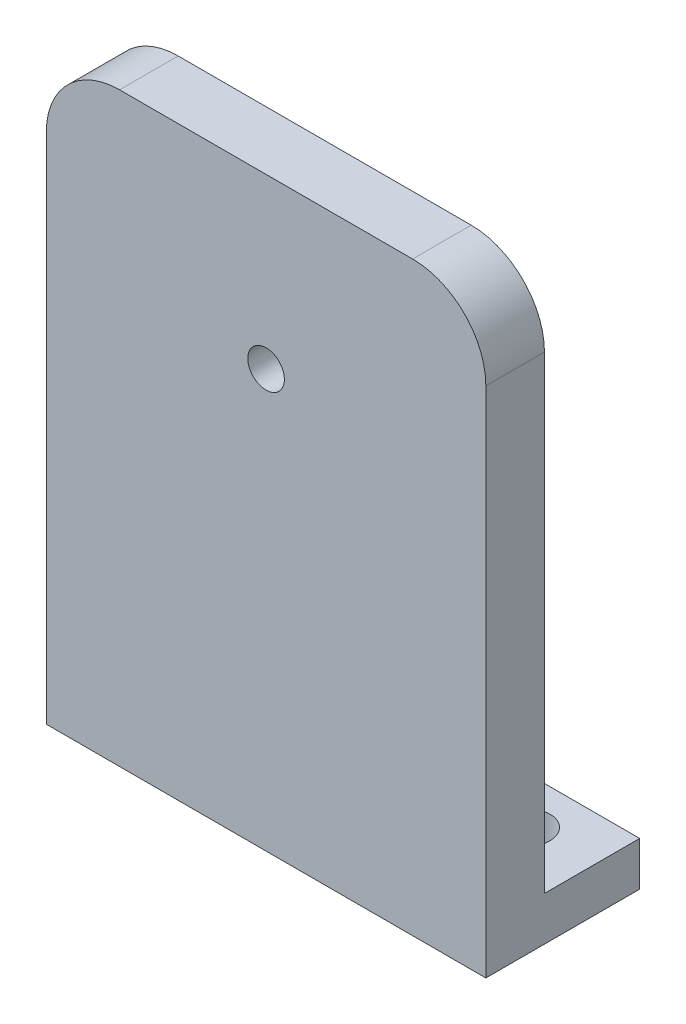
ISO-10303-21;
HEADER;
FILE_DESCRIPTION(('STEP AP214'),'2;1');
FILE_NAME('part.step','',(''),(''),'','','');
FILE_SCHEMA(('AUTOMOTIVE_DESIGN { 1 0 10303 214 1 1 1 1 }'));
ENDSEC;
DATA;
#1=APPLICATION_CONTEXT('core data for automotive mechanical design processes');
#2=APPLICATION_PROTOCOL_DEFINITION('international standard','automotive_design',2000,#1);
#3=PRODUCT_CONTEXT('',#1,'mechanical');
#4=PRODUCT('Part','Part','',(#3));
#5=PRODUCT_RELATED_PRODUCT_CATEGORY('part','',(#4));
#6=PRODUCT_DEFINITION_FORMATION('','',#4);
#7=PRODUCT_DEFINITION_CONTEXT('part definition',#1,'design');
#8=PRODUCT_DEFINITION('design','',#6,#7);
#9=PRODUCT_DEFINITION_SHAPE('','',#8);
#10=(LENGTH_UNIT() NAMED_UNIT(*) SI_UNIT(.MILLI.,.METRE.));
#11=(NAMED_UNIT(*) PLANE_ANGLE_UNIT() SI_UNIT($,.RADIAN.));
#12=(NAMED_UNIT(*) SI_UNIT($,.STERADIAN.) SOLID_ANGLE_UNIT());
#13=UNCERTAINTY_MEASURE_WITH_UNIT(LENGTH_MEASURE(1.E-05),#10,'distance_accuracy_value','');
#14=(GEOMETRIC_REPRESENTATION_CONTEXT(3) GLOBAL_UNCERTAINTY_ASSIGNED_CONTEXT((#13)) GLOBAL_UNIT_ASSIGNED_CONTEXT((#10,
#11,#12)) REPRESENTATION_CONTEXT('',''));
#15=CARTESIAN_POINT('',(0.,0.,0.));
#16=DIRECTION('',(0.,0.,1.));
#17=DIRECTION('',(1.,0.,0.));
#18=AXIS2_PLACEMENT_3D('',#15,#16,#17);
#19=CARTESIAN_POINT('',(0.,3.,0.));
#20=DIRECTION('',(0.,-1.,0.));
#21=DIRECTION('',(0.,0.,-1.));
#22=AXIS2_PLACEMENT_3D('',#19,#20,#21);
#23=PLANE('',#22);
#24=CARTESIAN_POINT('',(10.5,3.,-2.05));
#25=DIRECTION('',(0.,1.,0.));
#26=DIRECTION('',(0.,0.,1.));
#27=AXIS2_PLACEMENT_3D('',#24,#25,#26);
#28=CIRCLE('',#27,1.575);
#29=CARTESIAN_POINT('',(10.5,3.,-0.475));
#30=VERTEX_POINT('',#29);
#31=EDGE_CURVE('E313',#30,#30,#28,.T.);
#32=ORIENTED_EDGE('',*,*,#31,.F.);
#33=EDGE_LOOP('',(#32));
#34=FACE_BOUND('',#33,.T.);
#35=CARTESIAN_POINT('',(-10.5,3.,-2.05));
#36=DIRECTION('',(0.,1.,0.));
#37=DIRECTION('',(0.,0.,1.));
#38=AXIS2_PLACEMENT_3D('',#35,#36,#37);
#39=CIRCLE('',#38,1.575);
#40=CARTESIAN_POINT('',(-10.5,3.,-0.475));
#41=VERTEX_POINT('',#40);
#42=EDGE_CURVE('E127',#41,#41,#39,.T.);
#43=ORIENTED_EDGE('',*,*,#42,.F.);
#44=EDGE_LOOP('',(#43));
#45=FACE_BOUND('',#44,.T.);
#46=DIRECTION('',(-1.,0.,0.));
#47=VECTOR('',#46,1.);
#48=CARTESIAN_POINT('',(-15.,3.,1.25));
#49=LINE('',#48,#47);
#50=CARTESIAN_POINT('',(15.,3.,1.25));
#51=VERTEX_POINT('',#50);
#52=CARTESIAN_POINT('',(-15.,3.,1.25));
#53=VERTEX_POINT('',#52);
#54=EDGE_CURVE('E112',#51,#53,#49,.T.);
#55=ORIENTED_EDGE('',*,*,#54,.F.);
#56=DIRECTION('',(0.,0.,-1.));
#57=VECTOR('',#56,1.);
#58=CARTESIAN_POINT('',(15.,3.,5.25));
#59=LINE('',#58,#57);
#60=CARTESIAN_POINT('',(15.,3.,-5.25));
#61=VERTEX_POINT('',#60);
#62=EDGE_CURVE('E133',#51,#61,#59,.T.);
#63=ORIENTED_EDGE('',*,*,#62,.T.);
#64=DIRECTION('',(-1.,0.,0.));
#65=VECTOR('',#64,1.);
#66=CARTESIAN_POINT('',(-15.,3.,-5.25));
#67=LINE('',#66,#65);
#68=CARTESIAN_POINT('',(-15.,3.,-5.25));
#69=VERTEX_POINT('',#68);
#70=EDGE_CURVE('E115',#61,#69,#67,.T.);
#71=ORIENTED_EDGE('',*,*,#70,.T.);
#72=DIRECTION('',(0.,0.,1.));
#73=VECTOR('',#72,1.);
#74=CARTESIAN_POINT('',(-15.,3.,5.25));
#75=LINE('',#74,#73);
#76=EDGE_CURVE('E102',#69,#53,#75,.T.);
#77=ORIENTED_EDGE('',*,*,#76,.T.);
#78=EDGE_LOOP('',(#55,#63,#71,#77));
#79=FACE_BOUND('',#78,.T.);
#80=ADVANCED_FACE('F32',(#34,#45,#79),#23,.F.);
#81=CARTESIAN_POINT('',(15.,3.,5.25));
#82=DIRECTION('',(-1.,0.,0.));
#83=DIRECTION('',(0.,0.,1.));
#84=AXIS2_PLACEMENT_3D('',#81,#82,#83);
#85=PLANE('',#84);
#86=DIRECTION('',(0.,-1.,0.));
#87=VECTOR('',#86,1.);
#88=CARTESIAN_POINT('',(15.,40.,1.25));
#89=LINE('',#88,#87);
#90=CARTESIAN_POINT('',(15.,35.,1.25));
#91=VERTEX_POINT('',#90);
#92=EDGE_CURVE('E107',#91,#51,#89,.T.);
#93=ORIENTED_EDGE('',*,*,#92,.F.);
#94=DIRECTION('',(0.,0.,-1.));
#95=VECTOR('',#94,1.);
#96=CARTESIAN_POINT('',(15.,35.,5.25));
#97=LINE('',#96,#95);
#98=CARTESIAN_POINT('',(15.,35.,5.25));
#99=VERTEX_POINT('',#98);
#100=EDGE_CURVE('E56',#91,#99,#97,.F.);
#101=ORIENTED_EDGE('',*,*,#100,.T.);
#102=DIRECTION('',(0.,-1.,0.));
#103=VECTOR('',#102,1.);
#104=CARTESIAN_POINT('',(15.,3.,5.25));
#105=LINE('',#104,#103);
#106=CARTESIAN_POINT('',(15.,0.,5.25));
#107=VERTEX_POINT('',#106);
#108=EDGE_CURVE('E117',#99,#107,#105,.T.);
#109=ORIENTED_EDGE('',*,*,#108,.T.);
#110=DIRECTION('',(0.,0.,-1.));
#111=VECTOR('',#110,1.);
#112=CARTESIAN_POINT('',(15.,0.,5.25));
#113=LINE('',#112,#111);
#114=CARTESIAN_POINT('',(15.,0.,-5.25));
#115=VERTEX_POINT('',#114);
#116=EDGE_CURVE('E132',#107,#115,#113,.T.);
#117=ORIENTED_EDGE('',*,*,#116,.T.);
#118=DIRECTION('',(0.,-1.,0.));
#119=VECTOR('',#118,1.);
#120=CARTESIAN_POINT('',(15.,3.,-5.25));
#121=LINE('',#120,#119);
#122=EDGE_CURVE('E151',#61,#115,#121,.T.);
#123=ORIENTED_EDGE('',*,*,#122,.F.);
#124=ORIENTED_EDGE('',*,*,#62,.F.);
#125=EDGE_LOOP('',(#93,#101,#109,#117,#123,#124));
#126=FACE_BOUND('',#125,.T.);
#127=ADVANCED_FACE('F175',(#126),#85,.F.);
#128=CARTESIAN_POINT('',(-15.,3.,-5.25));
#129=DIRECTION('',(0.,0.,1.));
#130=DIRECTION('',(1.,0.,0.));
#131=AXIS2_PLACEMENT_3D('',#128,#129,#130);
#132=PLANE('',#131);
#133=DIRECTION('',(-1.,0.,0.));
#134=VECTOR('',#133,1.);
#135=CARTESIAN_POINT('',(-15.,0.,-5.25));
#136=LINE('',#135,#134);
#137=CARTESIAN_POINT('',(-15.,0.,-5.25));
#138=VERTEX_POINT('',#137);
#139=EDGE_CURVE('E139',#115,#138,#136,.T.);
#140=ORIENTED_EDGE('',*,*,#139,.T.);
#141=DIRECTION('',(0.,-1.,0.));
#142=VECTOR('',#141,1.);
#143=CARTESIAN_POINT('',(-15.,3.,-5.25));
#144=LINE('',#143,#142);
#145=EDGE_CURVE('E149',#69,#138,#144,.T.);
#146=ORIENTED_EDGE('',*,*,#145,.F.);
#147=ORIENTED_EDGE('',*,*,#70,.F.);
#148=ORIENTED_EDGE('',*,*,#122,.T.);
#149=EDGE_LOOP('',(#140,#146,#147,#148));
#150=FACE_BOUND('',#149,.T.);
#151=ADVANCED_FACE('F178',(#150),#132,.F.);
#152=CARTESIAN_POINT('',(-15.,3.,5.25));
#153=DIRECTION('',(1.,0.,0.));
#154=DIRECTION('',(0.,0.,-1.));
#155=AXIS2_PLACEMENT_3D('',#152,#153,#154);
#156=PLANE('',#155);
#157=DIRECTION('',(0.,-1.,0.));
#158=VECTOR('',#157,1.);
#159=CARTESIAN_POINT('',(-15.,3.,5.25));
#160=LINE('',#159,#158);
#161=CARTESIAN_POINT('',(-15.,35.,5.25));
#162=VERTEX_POINT('',#161);
#163=CARTESIAN_POINT('',(-15.,0.,5.25));
#164=VERTEX_POINT('',#163);
#165=EDGE_CURVE('E147',#162,#164,#160,.T.);
#166=ORIENTED_EDGE('',*,*,#165,.F.);
#167=DIRECTION('',(0.,0.,1.));
#168=VECTOR('',#167,1.);
#169=CARTESIAN_POINT('',(-15.,35.,5.25));
#170=LINE('',#169,#168);
#171=CARTESIAN_POINT('',(-15.,35.,1.25));
#172=VERTEX_POINT('',#171);
#173=EDGE_CURVE('E11',#162,#172,#170,.F.);
#174=ORIENTED_EDGE('',*,*,#173,.T.);
#175=DIRECTION('',(0.,-1.,0.));
#176=VECTOR('',#175,1.);
#177=CARTESIAN_POINT('',(-15.,40.,1.25));
#178=LINE('',#177,#176);
#179=EDGE_CURVE('E98',#172,#53,#178,.T.);
#180=ORIENTED_EDGE('',*,*,#179,.T.);
#181=ORIENTED_EDGE('',*,*,#76,.F.);
#182=ORIENTED_EDGE('',*,*,#145,.T.);
#183=DIRECTION('',(0.,0.,1.));
#184=VECTOR('',#183,1.);
#185=CARTESIAN_POINT('',(-15.,0.,5.25));
#186=LINE('',#185,#184);
#187=EDGE_CURVE('E141',#138,#164,#186,.T.);
#188=ORIENTED_EDGE('',*,*,#187,.T.);
#189=EDGE_LOOP('',(#166,#174,#180,#181,#182,#188));
#190=FACE_BOUND('',#189,.T.);
#191=ADVANCED_FACE('F100',(#190),#156,.F.);
#192=CARTESIAN_POINT('',(-15.,3.,5.25));
#193=DIRECTION('',(0.,0.,-1.));
#194=DIRECTION('',(-1.,0.,0.));
#195=AXIS2_PLACEMENT_3D('',#192,#193,#194);
#196=PLANE('',#195);
#197=CARTESIAN_POINT('',(0.,28.5,5.25));
#198=DIRECTION('',(0.,0.,1.));
#199=DIRECTION('',(1.,0.,0.));
#200=AXIS2_PLACEMENT_3D('',#197,#198,#199);
#201=CIRCLE('',#200,1.25);
#202=CARTESIAN_POINT('',(1.25,28.5,5.25));
#203=VERTEX_POINT('',#202);
#204=EDGE_CURVE('E317',#203,#203,#201,.T.);
#205=ORIENTED_EDGE('',*,*,#204,.F.);
#206=EDGE_LOOP('',(#205));
#207=FACE_BOUND('',#206,.T.);
#208=ORIENTED_EDGE('',*,*,#108,.F.);
#209=CARTESIAN_POINT('',(10.,35.,5.25));
#210=DIRECTION('',(0.,0.,-1.));
#211=DIRECTION('',(-1.,0.,0.));
#212=AXIS2_PLACEMENT_3D('',#209,#210,#211);
#213=CIRCLE('',#212,5.);
#214=CARTESIAN_POINT('',(10.,40.,5.25));
#215=VERTEX_POINT('',#214);
#216=EDGE_CURVE('E41',#99,#215,#213,.F.);
#217=ORIENTED_EDGE('',*,*,#216,.T.);
#218=DIRECTION('',(1.,0.,0.));
#219=VECTOR('',#218,1.);
#220=CARTESIAN_POINT('',(-15.,40.,5.25));
#221=LINE('',#220,#219);
#222=CARTESIAN_POINT('',(-10.,40.,5.25));
#223=VERTEX_POINT('',#222);
#224=EDGE_CURVE('E121',#223,#215,#221,.T.);
#225=ORIENTED_EDGE('',*,*,#224,.F.);
#226=CARTESIAN_POINT('',(-10.,35.,5.25));
#227=DIRECTION('',(0.,0.,-1.));
#228=DIRECTION('',(-1.,0.,0.));
#229=AXIS2_PLACEMENT_3D('',#226,#227,#228);
#230=CIRCLE('',#229,5.);
#231=EDGE_CURVE('E48',#223,#162,#230,.F.);
#232=ORIENTED_EDGE('',*,*,#231,.T.);
#233=ORIENTED_EDGE('',*,*,#165,.T.);
#234=DIRECTION('',(1.,0.,0.));
#235=VECTOR('',#234,1.);
#236=CARTESIAN_POINT('',(-15.,0.,5.25));
#237=LINE('',#236,#235);
#238=EDGE_CURVE('E135',#164,#107,#237,.T.);
#239=ORIENTED_EDGE('',*,*,#238,.T.);
#240=EDGE_LOOP('',(#208,#217,#225,#232,#233,#239));
#241=FACE_BOUND('',#240,.T.);
#242=ADVANCED_FACE('F167',(#207,#241),#196,.F.);
#243=CARTESIAN_POINT('',(0.,0.,0.));
#244=DIRECTION('',(0.,-1.,0.));
#245=DIRECTION('',(0.,0.,-1.));
#246=AXIS2_PLACEMENT_3D('',#243,#244,#245);
#247=PLANE('',#246);
#248=CARTESIAN_POINT('',(10.5,0.,-2.05));
#249=DIRECTION('',(0.,1.,0.));
#250=DIRECTION('',(0.,0.,1.));
#251=AXIS2_PLACEMENT_3D('',#248,#249,#250);
#252=CIRCLE('',#251,1.575);
#253=CARTESIAN_POINT('',(10.5,0.,-0.475));
#254=VERTEX_POINT('',#253);
#255=EDGE_CURVE('E311',#254,#254,#252,.T.);
#256=ORIENTED_EDGE('',*,*,#255,.T.);
#257=EDGE_LOOP('',(#256));
#258=FACE_BOUND('',#257,.T.);
#259=CARTESIAN_POINT('',(-10.5,0.,-2.05));
#260=DIRECTION('',(0.,1.,0.));
#261=DIRECTION('',(0.,0.,1.));
#262=AXIS2_PLACEMENT_3D('',#259,#260,#261);
#263=CIRCLE('',#262,1.575);
#264=CARTESIAN_POINT('',(-10.5,0.,-0.475));
#265=VERTEX_POINT('',#264);
#266=EDGE_CURVE('E122',#265,#265,#263,.T.);
#267=ORIENTED_EDGE('',*,*,#266,.T.);
#268=EDGE_LOOP('',(#267));
#269=FACE_BOUND('',#268,.T.);
#270=ORIENTED_EDGE('',*,*,#116,.F.);
#271=ORIENTED_EDGE('',*,*,#238,.F.);
#272=ORIENTED_EDGE('',*,*,#187,.F.);
#273=ORIENTED_EDGE('',*,*,#139,.F.);
#274=EDGE_LOOP('',(#270,#271,#272,#273));
#275=FACE_BOUND('',#274,.T.);
#276=ADVANCED_FACE('F183',(#258,#269,#275),#247,.T.);
#277=CARTESIAN_POINT('',(-15.,40.,1.25));
#278=DIRECTION('',(0.,0.,1.));
#279=DIRECTION('',(1.,0.,0.));
#280=AXIS2_PLACEMENT_3D('',#277,#278,#279);
#281=PLANE('',#280);
#282=CARTESIAN_POINT('',(0.,28.5,1.25));
#283=DIRECTION('',(0.,0.,1.));
#284=DIRECTION('',(1.,0.,0.));
#285=AXIS2_PLACEMENT_3D('',#282,#283,#284);
#286=CIRCLE('',#285,1.25);
#287=CARTESIAN_POINT('',(1.25,28.5,1.25));
#288=VERTEX_POINT('',#287);
#289=EDGE_CURVE('E36',#288,#288,#286,.T.);
#290=ORIENTED_EDGE('',*,*,#289,.T.);
#291=EDGE_LOOP('',(#290));
#292=FACE_BOUND('',#291,.T.);
#293=DIRECTION('',(-1.,0.,0.));
#294=VECTOR('',#293,1.);
#295=CARTESIAN_POINT('',(-15.,40.,1.25));
#296=LINE('',#295,#294);
#297=CARTESIAN_POINT('',(10.,40.,1.25));
#298=VERTEX_POINT('',#297);
#299=CARTESIAN_POINT('',(-10.,40.,1.25));
#300=VERTEX_POINT('',#299);
#301=EDGE_CURVE('E108',#298,#300,#296,.T.);
#302=ORIENTED_EDGE('',*,*,#301,.F.);
#303=CARTESIAN_POINT('',(10.,35.,1.25));
#304=DIRECTION('',(0.,0.,1.));
#305=DIRECTION('',(1.,0.,0.));
#306=AXIS2_PLACEMENT_3D('',#303,#304,#305);
#307=CIRCLE('',#306,5.);
#308=EDGE_CURVE('E162',#298,#91,#307,.F.);
#309=ORIENTED_EDGE('',*,*,#308,.T.);
#310=ORIENTED_EDGE('',*,*,#92,.T.);
#311=ORIENTED_EDGE('',*,*,#54,.T.);
#312=ORIENTED_EDGE('',*,*,#179,.F.);
#313=CARTESIAN_POINT('',(-10.,35.,1.25));
#314=DIRECTION('',(0.,0.,1.));
#315=DIRECTION('',(1.,0.,0.));
#316=AXIS2_PLACEMENT_3D('',#313,#314,#315);
#317=CIRCLE('',#316,5.);
#318=EDGE_CURVE('E160',#172,#300,#317,.F.);
#319=ORIENTED_EDGE('',*,*,#318,.T.);
#320=EDGE_LOOP('',(#302,#309,#310,#311,#312,#319));
#321=FACE_BOUND('',#320,.T.);
#322=ADVANCED_FACE('F120',(#292,#321),#281,.F.);
#323=CARTESIAN_POINT('',(0.,40.,0.));
#324=DIRECTION('',(0.,-1.,0.));
#325=DIRECTION('',(0.,0.,-1.));
#326=AXIS2_PLACEMENT_3D('',#323,#324,#325);
#327=PLANE('',#326);
#328=ORIENTED_EDGE('',*,*,#224,.T.);
#329=DIRECTION('',(0.,0.,-1.));
#330=VECTOR('',#329,1.);
#331=CARTESIAN_POINT('',(10.,40.,0.));
#332=LINE('',#331,#330);
#333=EDGE_CURVE('E157',#215,#298,#332,.T.);
#334=ORIENTED_EDGE('',*,*,#333,.T.);
#335=ORIENTED_EDGE('',*,*,#301,.T.);
#336=DIRECTION('',(0.,0.,1.));
#337=VECTOR('',#336,1.);
#338=CARTESIAN_POINT('',(-10.,40.,0.));
#339=LINE('',#338,#337);
#340=EDGE_CURVE('E154',#300,#223,#339,.T.);
#341=ORIENTED_EDGE('',*,*,#340,.T.);
#342=EDGE_LOOP('',(#328,#334,#335,#341));
#343=FACE_BOUND('',#342,.T.);
#344=ADVANCED_FACE('F171',(#343),#327,.F.);
#345=CARTESIAN_POINT('',(-10.5,0.,-2.05));
#346=DIRECTION('',(0.,1.,0.));
#347=DIRECTION('',(0.,0.,1.));
#348=AXIS2_PLACEMENT_3D('',#345,#346,#347);
#349=CYLINDRICAL_SURFACE('',#348,1.575);
#350=ORIENTED_EDGE('',*,*,#266,.F.);
#351=EDGE_LOOP('',(#350));
#352=FACE_BOUND('',#351,.T.);
#353=ORIENTED_EDGE('',*,*,#42,.T.);
#354=EDGE_LOOP('',(#353));
#355=FACE_BOUND('',#354,.T.);
#356=ADVANCED_FACE('F246',(#352,#355),#349,.F.);
#357=CARTESIAN_POINT('',(10.5,0.,-2.05));
#358=DIRECTION('',(0.,1.,0.));
#359=DIRECTION('',(0.,0.,1.));
#360=AXIS2_PLACEMENT_3D('',#357,#358,#359);
#361=CYLINDRICAL_SURFACE('',#360,1.575);
#362=ORIENTED_EDGE('',*,*,#255,.F.);
#363=EDGE_LOOP('',(#362));
#364=FACE_BOUND('',#363,.T.);
#365=ORIENTED_EDGE('',*,*,#31,.T.);
#366=EDGE_LOOP('',(#365));
#367=FACE_BOUND('',#366,.T.);
#368=ADVANCED_FACE('F193',(#364,#367),#361,.F.);
#369=CARTESIAN_POINT('',(10.,35.,0.));
#370=DIRECTION('',(0.,0.,-1.));
#371=DIRECTION('',(-1.,0.,0.));
#372=AXIS2_PLACEMENT_3D('',#369,#370,#371);
#373=CYLINDRICAL_SURFACE('',#372,5.);
#374=ORIENTED_EDGE('',*,*,#216,.F.);
#375=ORIENTED_EDGE('',*,*,#100,.F.);
#376=ORIENTED_EDGE('',*,*,#308,.F.);
#377=ORIENTED_EDGE('',*,*,#333,.F.);
#378=EDGE_LOOP('',(#374,#375,#376,#377));
#379=FACE_BOUND('',#378,.T.);
#380=ADVANCED_FACE('F174',(#379),#373,.T.);
#381=CARTESIAN_POINT('',(-10.,35.,0.));
#382=DIRECTION('',(0.,0.,1.));
#383=DIRECTION('',(1.,0.,0.));
#384=AXIS2_PLACEMENT_3D('',#381,#382,#383);
#385=CYLINDRICAL_SURFACE('',#384,5.);
#386=ORIENTED_EDGE('',*,*,#318,.F.);
#387=ORIENTED_EDGE('',*,*,#173,.F.);
#388=ORIENTED_EDGE('',*,*,#231,.F.);
#389=ORIENTED_EDGE('',*,*,#340,.F.);
#390=EDGE_LOOP('',(#386,#387,#388,#389));
#391=FACE_BOUND('',#390,.T.);
#392=ADVANCED_FACE('F34',(#391),#385,.T.);
#393=CARTESIAN_POINT('',(0.,28.5,-5.25));
#394=DIRECTION('',(0.,0.,1.));
#395=DIRECTION('',(1.,0.,0.));
#396=AXIS2_PLACEMENT_3D('',#393,#394,#395);
#397=CYLINDRICAL_SURFACE('',#396,1.25);
#398=CARTESIAN_POINT('',(1.25,28.5,5.25));
#399=CARTESIAN_POINT('',(1.25,28.5,5.20833333333333));
#400=CARTESIAN_POINT('',(1.25,28.5,5.16666666666667));
#401=CARTESIAN_POINT('',(1.25,28.5,5.08333333333333));
#402=CARTESIAN_POINT('',(1.25,28.5,5.04166666666667));
#403=CARTESIAN_POINT('',(1.25,28.5,4.95833333333333));
#404=CARTESIAN_POINT('',(1.25,28.5,4.91666666666667));
#405=CARTESIAN_POINT('',(1.25,28.5,4.83333333333333));
#406=CARTESIAN_POINT('',(1.25,28.5,4.79166666666667));
#407=CARTESIAN_POINT('',(1.25,28.5,4.70833333333333));
#408=CARTESIAN_POINT('',(1.25,28.5,4.66666666666667));
#409=CARTESIAN_POINT('',(1.25,28.5,4.58333333333333));
#410=CARTESIAN_POINT('',(1.25,28.5,4.54166666666667));
#411=CARTESIAN_POINT('',(1.25,28.5,4.45833333333333));
#412=CARTESIAN_POINT('',(1.25,28.5,4.41666666666667));
#413=CARTESIAN_POINT('',(1.25,28.5,4.33333333333333));
#414=CARTESIAN_POINT('',(1.25,28.5,4.29166666666667));
#415=CARTESIAN_POINT('',(1.25,28.5,4.20833333333333));
#416=CARTESIAN_POINT('',(1.25,28.5,4.16666666666667));
#417=CARTESIAN_POINT('',(1.25,28.5,4.08333333333333));
#418=CARTESIAN_POINT('',(1.25,28.5,4.04166666666667));
#419=CARTESIAN_POINT('',(1.25,28.5,3.95833333333333));
#420=CARTESIAN_POINT('',(1.25,28.5,3.91666666666667));
#421=CARTESIAN_POINT('',(1.25,28.5,3.83333333333333));
#422=CARTESIAN_POINT('',(1.25,28.5,3.79166666666667));
#423=CARTESIAN_POINT('',(1.25,28.5,3.70833333333333));
#424=CARTESIAN_POINT('',(1.25,28.5,3.66666666666667));
#425=CARTESIAN_POINT('',(1.25,28.5,3.58333333333333));
#426=CARTESIAN_POINT('',(1.25,28.5,3.54166666666667));
#427=CARTESIAN_POINT('',(1.25,28.5,3.45833333333333));
#428=CARTESIAN_POINT('',(1.25,28.5,3.41666666666667));
#429=CARTESIAN_POINT('',(1.25,28.5,3.33333333333333));
#430=CARTESIAN_POINT('',(1.25,28.5,3.29166666666667));
#431=CARTESIAN_POINT('',(1.25,28.5,3.20833333333333));
#432=CARTESIAN_POINT('',(1.25,28.5,3.16666666666667));
#433=CARTESIAN_POINT('',(1.25,28.5,3.08333333333333));
#434=CARTESIAN_POINT('',(1.25,28.5,3.04166666666667));
#435=CARTESIAN_POINT('',(1.25,28.5,2.95833333333333));
#436=CARTESIAN_POINT('',(1.25,28.5,2.91666666666667));
#437=CARTESIAN_POINT('',(1.25,28.5,2.83333333333333));
#438=CARTESIAN_POINT('',(1.25,28.5,2.79166666666667));
#439=CARTESIAN_POINT('',(1.25,28.5,2.70833333333333));
#440=CARTESIAN_POINT('',(1.25,28.5,2.66666666666667));
#441=CARTESIAN_POINT('',(1.25,28.5,2.58333333333333));
#442=CARTESIAN_POINT('',(1.25,28.5,2.54166666666667));
#443=CARTESIAN_POINT('',(1.25,28.5,2.45833333333333));
#444=CARTESIAN_POINT('',(1.25,28.5,2.41666666666667));
#445=CARTESIAN_POINT('',(1.25,28.5,2.33333333333333));
#446=CARTESIAN_POINT('',(1.25,28.5,2.29166666666667));
#447=CARTESIAN_POINT('',(1.25,28.5,2.20833333333333));
#448=CARTESIAN_POINT('',(1.25,28.5,2.16666666666667));
#449=CARTESIAN_POINT('',(1.25,28.5,2.08333333333333));
#450=CARTESIAN_POINT('',(1.25,28.5,2.04166666666667));
#451=CARTESIAN_POINT('',(1.25,28.5,1.95833333333333));
#452=CARTESIAN_POINT('',(1.25,28.5,1.91666666666667));
#453=CARTESIAN_POINT('',(1.25,28.5,1.83333333333333));
#454=CARTESIAN_POINT('',(1.25,28.5,1.79166666666667));
#455=CARTESIAN_POINT('',(1.25,28.5,1.70833333333333));
#456=CARTESIAN_POINT('',(1.25,28.5,1.66666666666667));
#457=CARTESIAN_POINT('',(1.25,28.5,1.58333333333333));
#458=CARTESIAN_POINT('',(1.25,28.5,1.54166666666667));
#459=CARTESIAN_POINT('',(1.25,28.5,1.45833333333333));
#460=CARTESIAN_POINT('',(1.25,28.5,1.41666666666667));
#461=CARTESIAN_POINT('',(1.25,28.5,1.33333333333333));
#462=CARTESIAN_POINT('',(1.25,28.5,1.29166666666667));
#463=CARTESIAN_POINT('',(1.25,28.5,1.25));
#464=B_SPLINE_CURVE_WITH_KNOTS('',3,(#398,#399,#400,#401,#402,#403,#404,#405,#406,#407,#408,
#409,#410,#411,#412,#413,#414,#415,#416,#417,#418,#419,#420,#421,#422,#423,#424,#425,#426,#427,
#428,#429,#430,#431,#432,#433,#434,#435,#436,#437,#438,#439,#440,#441,#442,#443,#444,#445,#446,
#447,#448,#449,#450,#451,#452,#453,#454,#455,#456,#457,#458,#459,#460,#461,#462,#463),
.UNSPECIFIED.,.F.,.F.,(4,2,2,2,2,2,2,2,2,2,2,2,2,2,2,2,2,2,2,2,2,2,2,2,2,2,2,2,2,2,2,2,4),(0.,
0.125,0.25,0.375,0.5,0.625000000000001,0.750000000000001,0.875000000000001,1.,1.125,1.25,1.375,
1.5,1.625,1.75,1.875,2.,2.125,2.25,2.375,2.5,2.625,2.75,2.875,3.,3.125,3.25,3.375,3.5,3.625,
3.75,3.875,4.),.UNSPECIFIED.);
#465=EDGE_CURVE('BSEAM186',#203,#288,#464,.T.);
#466=ORIENTED_EDGE('',*,*,#204,.T.);
#467=ORIENTED_EDGE('',*,*,#289,.F.);
#468=ORIENTED_EDGE('',*,*,#465,.T.);
#469=ORIENTED_EDGE('',*,*,#465,.F.);
#470=EDGE_LOOP('',(#466,#468,#467,#469));
#471=FACE_BOUND('',#470,.T.);
#472=ADVANCED_FACE('F186',(#471),#397,.F.);
#473=CLOSED_SHELL('',(#80,#127,#151,#191,#242,#276,#322,#344,#356,#368,#380,#392,#472));
#474=MANIFOLD_SOLID_BREP('B2',#473);
#475=ADVANCED_BREP_SHAPE_REPRESENTATION('',(#18,#474),#14);
#476=SHAPE_DEFINITION_REPRESENTATION(#9,#475);
ENDSEC;
END-ISO-10303-21;
